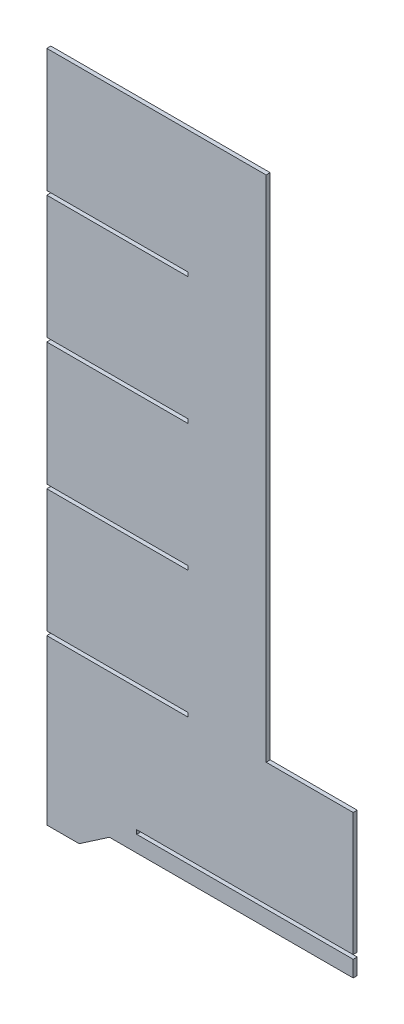
ISO-10303-21;
HEADER;
FILE_DESCRIPTION(('STEP AP214'),'2;1');
FILE_NAME('part.step','',(''),(''),'','','');
FILE_SCHEMA(('AUTOMOTIVE_DESIGN { 1 0 10303 214 1 1 1 1 }'));
ENDSEC;
DATA;
#1=APPLICATION_CONTEXT('core data for automotive mechanical design processes');
#2=APPLICATION_PROTOCOL_DEFINITION('international standard','automotive_design',2000,#1);
#3=PRODUCT_CONTEXT('',#1,'mechanical');
#4=PRODUCT('Part','Part','',(#3));
#5=PRODUCT_RELATED_PRODUCT_CATEGORY('part','',(#4));
#6=PRODUCT_DEFINITION_FORMATION('','',#4);
#7=PRODUCT_DEFINITION_CONTEXT('part definition',#1,'design');
#8=PRODUCT_DEFINITION('design','',#6,#7);
#9=PRODUCT_DEFINITION_SHAPE('','',#8);
#10=(LENGTH_UNIT() NAMED_UNIT(*) SI_UNIT(.MILLI.,.METRE.));
#11=(NAMED_UNIT(*) PLANE_ANGLE_UNIT() SI_UNIT($,.RADIAN.));
#12=(NAMED_UNIT(*) SI_UNIT($,.STERADIAN.) SOLID_ANGLE_UNIT());
#13=UNCERTAINTY_MEASURE_WITH_UNIT(LENGTH_MEASURE(1.E-05),#10,'distance_accuracy_value','');
#14=(GEOMETRIC_REPRESENTATION_CONTEXT(3) GLOBAL_UNCERTAINTY_ASSIGNED_CONTEXT((#13)) GLOBAL_UNIT_ASSIGNED_CONTEXT((#10,
#11,#12)) REPRESENTATION_CONTEXT('',''));
#15=CARTESIAN_POINT('',(0.,0.,0.));
#16=DIRECTION('',(0.,0.,1.));
#17=DIRECTION('',(1.,0.,0.));
#18=AXIS2_PLACEMENT_3D('',#15,#16,#17);
#19=CARTESIAN_POINT('',(129.013076167851,-241.346695427661,3.175));
#20=DIRECTION('',(0.,1.,0.));
#21=DIRECTION('',(0.,0.,1.));
#22=AXIS2_PLACEMENT_3D('',#19,#20,#21);
#23=PLANE('',#22);
#24=DIRECTION('',(0.,0.,1.));
#25=VECTOR('',#24,1.);
#26=CARTESIAN_POINT('',(51.8072361678507,-241.346695427661,0.));
#27=LINE('',#26,#25);
#28=CARTESIAN_POINT('',(51.8072361678507,-241.346695427661,0.));
#29=VERTEX_POINT('',#28);
#30=CARTESIAN_POINT('',(51.8072361678507,-241.346695427661,3.175));
#31=VERTEX_POINT('',#30);
#32=EDGE_CURVE('E63',#29,#31,#27,.T.);
#33=ORIENTED_EDGE('',*,*,#32,.F.);
#34=DIRECTION('',(1.,0.,0.));
#35=VECTOR('',#34,1.);
#36=CARTESIAN_POINT('',(129.013076167851,-241.346695427661,0.));
#37=LINE('',#36,#35);
#38=CARTESIAN_POINT('',(221.723076167851,-241.346695427661,0.));
#39=VERTEX_POINT('',#38);
#40=EDGE_CURVE('E224',#29,#39,#37,.T.);
#41=ORIENTED_EDGE('',*,*,#40,.T.);
#42=DIRECTION('',(0.,0.,1.));
#43=VECTOR('',#42,1.);
#44=CARTESIAN_POINT('',(221.723076167851,-241.346695427661,0.));
#45=LINE('',#44,#43);
#46=CARTESIAN_POINT('',(221.723076167851,-241.346695427661,3.175));
#47=VERTEX_POINT('',#46);
#48=EDGE_CURVE('E226',#39,#47,#45,.T.);
#49=ORIENTED_EDGE('',*,*,#48,.T.);
#50=DIRECTION('',(1.,0.,0.));
#51=VECTOR('',#50,1.);
#52=CARTESIAN_POINT('',(129.013076167851,-241.346695427661,3.175));
#53=LINE('',#52,#51);
#54=EDGE_CURVE('E395',#31,#47,#53,.T.);
#55=ORIENTED_EDGE('',*,*,#54,.F.);
#56=EDGE_LOOP('',(#33,#41,#49,#55));
#57=FACE_BOUND('',#56,.T.);
#58=ADVANCED_FACE('F39',(#57),#23,.F.);
#59=CARTESIAN_POINT('',(129.013076167851,254.245404572339,3.175));
#60=DIRECTION('',(0.,-1.,0.));
#61=DIRECTION('',(0.,0.,-1.));
#62=AXIS2_PLACEMENT_3D('',#59,#60,#61);
#63=PLANE('',#62);
#64=DIRECTION('',(-1.,0.,0.));
#65=VECTOR('',#64,1.);
#66=CARTESIAN_POINT('',(129.013076167851,254.245404572339,0.));
#67=LINE('',#66,#65);
#68=CARTESIAN_POINT('',(153.407236167851,254.245404572339,0.));
#69=VERTEX_POINT('',#68);
#70=CARTESIAN_POINT('',(-18.6853838321491,254.245404572339,0.));
#71=VERTEX_POINT('',#70);
#72=EDGE_CURVE('E341',#69,#71,#67,.T.);
#73=ORIENTED_EDGE('',*,*,#72,.T.);
#74=DIRECTION('',(0.,0.,-1.));
#75=VECTOR('',#74,1.);
#76=CARTESIAN_POINT('',(-18.6853838321491,254.245404572339,3.175));
#77=LINE('',#76,#75);
#78=CARTESIAN_POINT('',(-18.6853838321491,254.245404572339,3.175));
#79=VERTEX_POINT('',#78);
#80=EDGE_CURVE('E11',#79,#71,#77,.T.);
#81=ORIENTED_EDGE('',*,*,#80,.F.);
#82=DIRECTION('',(-1.,0.,0.));
#83=VECTOR('',#82,1.);
#84=CARTESIAN_POINT('',(129.013076167851,254.245404572339,3.175));
#85=LINE('',#84,#83);
#86=CARTESIAN_POINT('',(153.407236167851,254.245404572339,3.175));
#87=VERTEX_POINT('',#86);
#88=EDGE_CURVE('E233',#87,#79,#85,.T.);
#89=ORIENTED_EDGE('',*,*,#88,.F.);
#90=DIRECTION('',(0.,0.,1.));
#91=VECTOR('',#90,1.);
#92=CARTESIAN_POINT('',(153.407236167851,254.245404572339,0.));
#93=LINE('',#92,#91);
#94=EDGE_CURVE('E335',#69,#87,#93,.T.);
#95=ORIENTED_EDGE('',*,*,#94,.F.);
#96=EDGE_LOOP('',(#73,#81,#89,#95));
#97=FACE_BOUND('',#96,.T.);
#98=ADVANCED_FACE('F41',(#97),#63,.F.);
#99=CARTESIAN_POINT('',(-18.6853838321491,254.245404572339,3.175));
#100=DIRECTION('',(1.,0.,0.));
#101=DIRECTION('',(0.,0.,-1.));
#102=AXIS2_PLACEMENT_3D('',#99,#100,#101);
#103=PLANE('',#102);
#104=DIRECTION('',(0.,-1.,0.));
#105=VECTOR('',#104,1.);
#106=CARTESIAN_POINT('',(-18.6853838321491,254.245404572339,0.));
#107=LINE('',#106,#105);
#108=CARTESIAN_POINT('',(-18.6853838321491,157.66698457234,0.));
#109=VERTEX_POINT('',#108);
#110=EDGE_CURVE('E401',#71,#109,#107,.T.);
#111=ORIENTED_EDGE('',*,*,#110,.T.);
#112=DIRECTION('',(0.,0.,-1.));
#113=VECTOR('',#112,1.);
#114=CARTESIAN_POINT('',(-18.6853838321491,157.66698457234,3.175));
#115=LINE('',#114,#113);
#116=CARTESIAN_POINT('',(-18.6853838321491,157.66698457234,3.175));
#117=VERTEX_POINT('',#116);
#118=EDGE_CURVE('E48',#117,#109,#115,.T.);
#119=ORIENTED_EDGE('',*,*,#118,.F.);
#120=DIRECTION('',(0.,-1.,0.));
#121=VECTOR('',#120,1.);
#122=CARTESIAN_POINT('',(-18.6853838321491,254.245404572339,3.175));
#123=LINE('',#122,#121);
#124=EDGE_CURVE('E344',#79,#117,#123,.T.);
#125=ORIENTED_EDGE('',*,*,#124,.F.);
#126=ORIENTED_EDGE('',*,*,#80,.T.);
#127=EDGE_LOOP('',(#111,#119,#125,#126));
#128=FACE_BOUND('',#127,.T.);
#129=ADVANCED_FACE('F536',(#128),#103,.F.);
#130=CARTESIAN_POINT('',(92.0884611678498,157.66698457234,3.175));
#131=DIRECTION('',(0.,1.,0.));
#132=DIRECTION('',(0.,0.,1.));
#133=AXIS2_PLACEMENT_3D('',#130,#131,#132);
#134=PLANE('',#133);
#135=DIRECTION('',(1.,0.,0.));
#136=VECTOR('',#135,1.);
#137=CARTESIAN_POINT('',(92.0884611678498,157.66698457234,0.));
#138=LINE('',#137,#136);
#139=CARTESIAN_POINT('',(92.0884611678498,157.66698457234,0.));
#140=VERTEX_POINT('',#139);
#141=EDGE_CURVE('E404',#109,#140,#138,.T.);
#142=ORIENTED_EDGE('',*,*,#141,.T.);
#143=DIRECTION('',(0.,0.,-1.));
#144=VECTOR('',#143,1.);
#145=CARTESIAN_POINT('',(92.0884611678498,157.66698457234,3.175));
#146=LINE('',#145,#144);
#147=CARTESIAN_POINT('',(92.0884611678498,157.66698457234,3.175));
#148=VERTEX_POINT('',#147);
#149=EDGE_CURVE('E506',#148,#140,#146,.T.);
#150=ORIENTED_EDGE('',*,*,#149,.F.);
#151=DIRECTION('',(1.,0.,0.));
#152=VECTOR('',#151,1.);
#153=CARTESIAN_POINT('',(92.0884611678498,157.66698457234,3.175));
#154=LINE('',#153,#152);
#155=EDGE_CURVE('E347',#117,#148,#154,.T.);
#156=ORIENTED_EDGE('',*,*,#155,.F.);
#157=ORIENTED_EDGE('',*,*,#118,.T.);
#158=EDGE_LOOP('',(#142,#150,#156,#157));
#159=FACE_BOUND('',#158,.T.);
#160=ADVANCED_FACE('F515',(#159),#134,.F.);
#161=CARTESIAN_POINT('',(92.0884611678498,157.66698457234,3.175));
#162=DIRECTION('',(1.,0.,0.));
#163=DIRECTION('',(0.,0.,-1.));
#164=AXIS2_PLACEMENT_3D('',#161,#162,#163);
#165=PLANE('',#164);
#166=DIRECTION('',(0.,-1.,0.));
#167=VECTOR('',#166,1.);
#168=CARTESIAN_POINT('',(92.0884611678498,157.66698457234,0.));
#169=LINE('',#168,#167);
#170=CARTESIAN_POINT('',(92.0884611678498,154.49198457234,0.));
#171=VERTEX_POINT('',#170);
#172=EDGE_CURVE('E407',#140,#171,#169,.T.);
#173=ORIENTED_EDGE('',*,*,#172,.T.);
#174=DIRECTION('',(0.,0.,-1.));
#175=VECTOR('',#174,1.);
#176=CARTESIAN_POINT('',(92.0884611678498,154.49198457234,3.175));
#177=LINE('',#176,#175);
#178=CARTESIAN_POINT('',(92.0884611678498,154.49198457234,3.175));
#179=VERTEX_POINT('',#178);
#180=EDGE_CURVE('E502',#179,#171,#177,.T.);
#181=ORIENTED_EDGE('',*,*,#180,.F.);
#182=DIRECTION('',(0.,-1.,0.));
#183=VECTOR('',#182,1.);
#184=CARTESIAN_POINT('',(92.0884611678498,157.66698457234,3.175));
#185=LINE('',#184,#183);
#186=EDGE_CURVE('E350',#148,#179,#185,.T.);
#187=ORIENTED_EDGE('',*,*,#186,.F.);
#188=ORIENTED_EDGE('',*,*,#149,.T.);
#189=EDGE_LOOP('',(#173,#181,#187,#188));
#190=FACE_BOUND('',#189,.T.);
#191=ADVANCED_FACE('F525',(#190),#165,.F.);
#192=CARTESIAN_POINT('',(92.0884611678498,154.49198457234,3.175));
#193=DIRECTION('',(0.,-1.,0.));
#194=DIRECTION('',(1.,0.,0.));
#195=AXIS2_PLACEMENT_3D('',#192,#193,#194);
#196=PLANE('',#195);
#197=DIRECTION('',(-1.,0.,0.));
#198=VECTOR('',#197,1.);
#199=CARTESIAN_POINT('',(92.0884611678498,154.49198457234,0.));
#200=LINE('',#199,#198);
#201=CARTESIAN_POINT('',(-18.6853838321491,154.49198457234,0.));
#202=VERTEX_POINT('',#201);
#203=EDGE_CURVE('E410',#171,#202,#200,.T.);
#204=ORIENTED_EDGE('',*,*,#203,.T.);
#205=DIRECTION('',(0.,0.,-1.));
#206=VECTOR('',#205,1.);
#207=CARTESIAN_POINT('',(-18.6853838321491,154.49198457234,3.175));
#208=LINE('',#207,#206);
#209=CARTESIAN_POINT('',(-18.6853838321491,154.49198457234,3.175));
#210=VERTEX_POINT('',#209);
#211=EDGE_CURVE('E498',#210,#202,#208,.T.);
#212=ORIENTED_EDGE('',*,*,#211,.F.);
#213=DIRECTION('',(-1.,0.,0.));
#214=VECTOR('',#213,1.);
#215=CARTESIAN_POINT('',(92.0884611678498,154.49198457234,3.175));
#216=LINE('',#215,#214);
#217=EDGE_CURVE('E353',#179,#210,#216,.T.);
#218=ORIENTED_EDGE('',*,*,#217,.F.);
#219=ORIENTED_EDGE('',*,*,#180,.T.);
#220=EDGE_LOOP('',(#204,#212,#218,#219));
#221=FACE_BOUND('',#220,.T.);
#222=ADVANCED_FACE('F529',(#221),#196,.F.);
#223=CARTESIAN_POINT('',(-18.6853838321491,154.49198457234,3.175));
#224=DIRECTION('',(1.,0.,0.));
#225=DIRECTION('',(0.,0.,-1.));
#226=AXIS2_PLACEMENT_3D('',#223,#224,#225);
#227=PLANE('',#226);
#228=DIRECTION('',(0.,-1.,0.));
#229=VECTOR('',#228,1.);
#230=CARTESIAN_POINT('',(-18.6853838321491,154.49198457234,0.));
#231=LINE('',#230,#229);
#232=CARTESIAN_POINT('',(-18.6853838321491,57.9135645723403,0.));
#233=VERTEX_POINT('',#232);
#234=EDGE_CURVE('E413',#202,#233,#231,.T.);
#235=ORIENTED_EDGE('',*,*,#234,.T.);
#236=DIRECTION('',(0.,0.,-1.));
#237=VECTOR('',#236,1.);
#238=CARTESIAN_POINT('',(-18.6853838321491,57.9135645723403,3.175));
#239=LINE('',#238,#237);
#240=CARTESIAN_POINT('',(-18.6853838321491,57.9135645723403,3.175));
#241=VERTEX_POINT('',#240);
#242=EDGE_CURVE('E494',#241,#233,#239,.T.);
#243=ORIENTED_EDGE('',*,*,#242,.F.);
#244=DIRECTION('',(0.,-1.,0.));
#245=VECTOR('',#244,1.);
#246=CARTESIAN_POINT('',(-18.6853838321491,154.49198457234,3.175));
#247=LINE('',#246,#245);
#248=EDGE_CURVE('E356',#210,#241,#247,.T.);
#249=ORIENTED_EDGE('',*,*,#248,.F.);
#250=ORIENTED_EDGE('',*,*,#211,.T.);
#251=EDGE_LOOP('',(#235,#243,#249,#250));
#252=FACE_BOUND('',#251,.T.);
#253=ADVANCED_FACE('F628',(#252),#227,.F.);
#254=CARTESIAN_POINT('',(92.0884611678505,57.9135645723403,3.175));
#255=DIRECTION('',(0.,1.,0.));
#256=DIRECTION('',(0.,0.,1.));
#257=AXIS2_PLACEMENT_3D('',#254,#255,#256);
#258=PLANE('',#257);
#259=DIRECTION('',(1.,0.,0.));
#260=VECTOR('',#259,1.);
#261=CARTESIAN_POINT('',(92.0884611678505,57.9135645723403,0.));
#262=LINE('',#261,#260);
#263=CARTESIAN_POINT('',(92.0884611678505,57.9135645723403,0.));
#264=VERTEX_POINT('',#263);
#265=EDGE_CURVE('E416',#233,#264,#262,.T.);
#266=ORIENTED_EDGE('',*,*,#265,.T.);
#267=DIRECTION('',(0.,0.,-1.));
#268=VECTOR('',#267,1.);
#269=CARTESIAN_POINT('',(92.0884611678505,57.9135645723403,3.175));
#270=LINE('',#269,#268);
#271=CARTESIAN_POINT('',(92.0884611678505,57.9135645723403,3.175));
#272=VERTEX_POINT('',#271);
#273=EDGE_CURVE('E490',#272,#264,#270,.T.);
#274=ORIENTED_EDGE('',*,*,#273,.F.);
#275=DIRECTION('',(1.,0.,0.));
#276=VECTOR('',#275,1.);
#277=CARTESIAN_POINT('',(92.0884611678505,57.9135645723403,3.175));
#278=LINE('',#277,#276);
#279=EDGE_CURVE('E359',#241,#272,#278,.T.);
#280=ORIENTED_EDGE('',*,*,#279,.F.);
#281=ORIENTED_EDGE('',*,*,#242,.T.);
#282=EDGE_LOOP('',(#266,#274,#280,#281));
#283=FACE_BOUND('',#282,.T.);
#284=ADVANCED_FACE('F626',(#283),#258,.F.);
#285=CARTESIAN_POINT('',(92.0884611678505,57.9135645723403,3.175));
#286=DIRECTION('',(1.,0.,0.));
#287=DIRECTION('',(0.,0.,-1.));
#288=AXIS2_PLACEMENT_3D('',#285,#286,#287);
#289=PLANE('',#288);
#290=DIRECTION('',(0.,-1.,0.));
#291=VECTOR('',#290,1.);
#292=CARTESIAN_POINT('',(92.0884611678505,57.9135645723403,0.));
#293=LINE('',#292,#291);
#294=CARTESIAN_POINT('',(92.0884611678505,54.7385645723401,0.));
#295=VERTEX_POINT('',#294);
#296=EDGE_CURVE('E419',#264,#295,#293,.T.);
#297=ORIENTED_EDGE('',*,*,#296,.T.);
#298=DIRECTION('',(0.,0.,-1.));
#299=VECTOR('',#298,1.);
#300=CARTESIAN_POINT('',(92.0884611678505,54.7385645723401,3.175));
#301=LINE('',#300,#299);
#302=CARTESIAN_POINT('',(92.0884611678505,54.7385645723401,3.175));
#303=VERTEX_POINT('',#302);
#304=EDGE_CURVE('E486',#303,#295,#301,.T.);
#305=ORIENTED_EDGE('',*,*,#304,.F.);
#306=DIRECTION('',(0.,-1.,0.));
#307=VECTOR('',#306,1.);
#308=CARTESIAN_POINT('',(92.0884611678505,57.9135645723403,3.175));
#309=LINE('',#308,#307);
#310=EDGE_CURVE('E362',#272,#303,#309,.T.);
#311=ORIENTED_EDGE('',*,*,#310,.F.);
#312=ORIENTED_EDGE('',*,*,#273,.T.);
#313=EDGE_LOOP('',(#297,#305,#311,#312));
#314=FACE_BOUND('',#313,.T.);
#315=ADVANCED_FACE('F622',(#314),#289,.F.);
#316=CARTESIAN_POINT('',(92.0884611678505,54.7385645723401,3.175));
#317=DIRECTION('',(0.,-1.,0.));
#318=DIRECTION('',(1.,0.,0.));
#319=AXIS2_PLACEMENT_3D('',#316,#317,#318);
#320=PLANE('',#319);
#321=DIRECTION('',(-1.,0.,0.));
#322=VECTOR('',#321,1.);
#323=CARTESIAN_POINT('',(92.0884611678505,54.7385645723401,0.));
#324=LINE('',#323,#322);
#325=CARTESIAN_POINT('',(-18.6853838321491,54.7385645723401,0.));
#326=VERTEX_POINT('',#325);
#327=EDGE_CURVE('E422',#295,#326,#324,.T.);
#328=ORIENTED_EDGE('',*,*,#327,.T.);
#329=DIRECTION('',(0.,0.,-1.));
#330=VECTOR('',#329,1.);
#331=CARTESIAN_POINT('',(-18.6853838321491,54.7385645723401,3.175));
#332=LINE('',#331,#330);
#333=CARTESIAN_POINT('',(-18.6853838321491,54.7385645723401,3.175));
#334=VERTEX_POINT('',#333);
#335=EDGE_CURVE('E482',#334,#326,#332,.T.);
#336=ORIENTED_EDGE('',*,*,#335,.F.);
#337=DIRECTION('',(-1.,0.,0.));
#338=VECTOR('',#337,1.);
#339=CARTESIAN_POINT('',(92.0884611678505,54.7385645723401,3.175));
#340=LINE('',#339,#338);
#341=EDGE_CURVE('E365',#303,#334,#340,.T.);
#342=ORIENTED_EDGE('',*,*,#341,.F.);
#343=ORIENTED_EDGE('',*,*,#304,.T.);
#344=EDGE_LOOP('',(#328,#336,#342,#343));
#345=FACE_BOUND('',#344,.T.);
#346=ADVANCED_FACE('F617',(#345),#320,.F.);
#347=CARTESIAN_POINT('',(-18.6853838321491,54.7385645723401,3.175));
#348=DIRECTION('',(1.,0.,0.));
#349=DIRECTION('',(0.,0.,-1.));
#350=AXIS2_PLACEMENT_3D('',#347,#348,#349);
#351=PLANE('',#350);
#352=DIRECTION('',(0.,-1.,0.));
#353=VECTOR('',#352,1.);
#354=CARTESIAN_POINT('',(-18.6853838321491,54.7385645723401,0.));
#355=LINE('',#354,#353);
#356=CARTESIAN_POINT('',(-18.6853838321491,-41.8398554276617,0.));
#357=VERTEX_POINT('',#356);
#358=EDGE_CURVE('E425',#326,#357,#355,.T.);
#359=ORIENTED_EDGE('',*,*,#358,.T.);
#360=DIRECTION('',(0.,0.,-1.));
#361=VECTOR('',#360,1.);
#362=CARTESIAN_POINT('',(-18.6853838321491,-41.8398554276617,3.175));
#363=LINE('',#362,#361);
#364=CARTESIAN_POINT('',(-18.6853838321491,-41.8398554276617,3.175));
#365=VERTEX_POINT('',#364);
#366=EDGE_CURVE('E478',#365,#357,#363,.T.);
#367=ORIENTED_EDGE('',*,*,#366,.F.);
#368=DIRECTION('',(0.,-1.,0.));
#369=VECTOR('',#368,1.);
#370=CARTESIAN_POINT('',(-18.6853838321491,54.7385645723401,3.175));
#371=LINE('',#370,#369);
#372=EDGE_CURVE('E368',#334,#365,#371,.T.);
#373=ORIENTED_EDGE('',*,*,#372,.F.);
#374=ORIENTED_EDGE('',*,*,#335,.T.);
#375=EDGE_LOOP('',(#359,#367,#373,#374));
#376=FACE_BOUND('',#375,.T.);
#377=ADVANCED_FACE('F611',(#376),#351,.F.);
#378=CARTESIAN_POINT('',(92.0884611678512,-41.8398554276617,3.175));
#379=DIRECTION('',(0.,1.,0.));
#380=DIRECTION('',(0.,0.,1.));
#381=AXIS2_PLACEMENT_3D('',#378,#379,#380);
#382=PLANE('',#381);
#383=DIRECTION('',(1.,0.,0.));
#384=VECTOR('',#383,1.);
#385=CARTESIAN_POINT('',(92.0884611678512,-41.8398554276617,0.));
#386=LINE('',#385,#384);
#387=CARTESIAN_POINT('',(92.0884611678512,-41.8398554276617,0.));
#388=VERTEX_POINT('',#387);
#389=EDGE_CURVE('E428',#357,#388,#386,.T.);
#390=ORIENTED_EDGE('',*,*,#389,.T.);
#391=DIRECTION('',(0.,0.,-1.));
#392=VECTOR('',#391,1.);
#393=CARTESIAN_POINT('',(92.0884611678512,-41.8398554276617,3.175));
#394=LINE('',#393,#392);
#395=CARTESIAN_POINT('',(92.0884611678512,-41.8398554276617,3.175));
#396=VERTEX_POINT('',#395);
#397=EDGE_CURVE('E474',#396,#388,#394,.T.);
#398=ORIENTED_EDGE('',*,*,#397,.F.);
#399=DIRECTION('',(1.,0.,0.));
#400=VECTOR('',#399,1.);
#401=CARTESIAN_POINT('',(92.0884611678512,-41.8398554276617,3.175));
#402=LINE('',#401,#400);
#403=EDGE_CURVE('E371',#365,#396,#402,.T.);
#404=ORIENTED_EDGE('',*,*,#403,.F.);
#405=ORIENTED_EDGE('',*,*,#366,.T.);
#406=EDGE_LOOP('',(#390,#398,#404,#405));
#407=FACE_BOUND('',#406,.T.);
#408=ADVANCED_FACE('F607',(#407),#382,.F.);
#409=CARTESIAN_POINT('',(92.0884611678512,-41.8398554276617,3.175));
#410=DIRECTION('',(1.,0.,0.));
#411=DIRECTION('',(0.,0.,-1.));
#412=AXIS2_PLACEMENT_3D('',#409,#410,#411);
#413=PLANE('',#412);
#414=DIRECTION('',(0.,-1.,0.));
#415=VECTOR('',#414,1.);
#416=CARTESIAN_POINT('',(92.0884611678512,-41.8398554276617,0.));
#417=LINE('',#416,#415);
#418=CARTESIAN_POINT('',(92.0884611678512,-45.0148554276619,0.));
#419=VERTEX_POINT('',#418);
#420=EDGE_CURVE('E431',#388,#419,#417,.T.);
#421=ORIENTED_EDGE('',*,*,#420,.T.);
#422=DIRECTION('',(0.,0.,-1.));
#423=VECTOR('',#422,1.);
#424=CARTESIAN_POINT('',(92.0884611678512,-45.0148554276619,3.175));
#425=LINE('',#424,#423);
#426=CARTESIAN_POINT('',(92.0884611678512,-45.0148554276619,3.175));
#427=VERTEX_POINT('',#426);
#428=EDGE_CURVE('E470',#427,#419,#425,.T.);
#429=ORIENTED_EDGE('',*,*,#428,.F.);
#430=DIRECTION('',(0.,-1.,0.));
#431=VECTOR('',#430,1.);
#432=CARTESIAN_POINT('',(92.0884611678512,-41.8398554276617,3.175));
#433=LINE('',#432,#431);
#434=EDGE_CURVE('E374',#396,#427,#433,.T.);
#435=ORIENTED_EDGE('',*,*,#434,.F.);
#436=ORIENTED_EDGE('',*,*,#397,.T.);
#437=EDGE_LOOP('',(#421,#429,#435,#436));
#438=FACE_BOUND('',#437,.T.);
#439=ADVANCED_FACE('F602',(#438),#413,.F.);
#440=CARTESIAN_POINT('',(92.0884611678512,-45.0148554276619,3.175));
#441=DIRECTION('',(0.,-1.,0.));
#442=DIRECTION('',(1.,0.,0.));
#443=AXIS2_PLACEMENT_3D('',#440,#441,#442);
#444=PLANE('',#443);
#445=DIRECTION('',(-1.,0.,0.));
#446=VECTOR('',#445,1.);
#447=CARTESIAN_POINT('',(92.0884611678512,-45.0148554276619,0.));
#448=LINE('',#447,#446);
#449=CARTESIAN_POINT('',(-18.6853838321491,-45.0148554276619,0.));
#450=VERTEX_POINT('',#449);
#451=EDGE_CURVE('E434',#419,#450,#448,.T.);
#452=ORIENTED_EDGE('',*,*,#451,.T.);
#453=DIRECTION('',(0.,0.,-1.));
#454=VECTOR('',#453,1.);
#455=CARTESIAN_POINT('',(-18.6853838321491,-45.0148554276619,3.175));
#456=LINE('',#455,#454);
#457=CARTESIAN_POINT('',(-18.6853838321491,-45.0148554276619,3.175));
#458=VERTEX_POINT('',#457);
#459=EDGE_CURVE('E466',#458,#450,#456,.T.);
#460=ORIENTED_EDGE('',*,*,#459,.F.);
#461=DIRECTION('',(-1.,0.,0.));
#462=VECTOR('',#461,1.);
#463=CARTESIAN_POINT('',(92.0884611678512,-45.0148554276619,3.175));
#464=LINE('',#463,#462);
#465=EDGE_CURVE('E377',#427,#458,#464,.T.);
#466=ORIENTED_EDGE('',*,*,#465,.F.);
#467=ORIENTED_EDGE('',*,*,#428,.T.);
#468=EDGE_LOOP('',(#452,#460,#466,#467));
#469=FACE_BOUND('',#468,.T.);
#470=ADVANCED_FACE('F596',(#469),#444,.F.);
#471=CARTESIAN_POINT('',(-18.6853838321491,-45.0148554276619,3.175));
#472=DIRECTION('',(1.,0.,0.));
#473=DIRECTION('',(0.,0.,-1.));
#474=AXIS2_PLACEMENT_3D('',#471,#472,#473);
#475=PLANE('',#474);
#476=DIRECTION('',(0.,-1.,0.));
#477=VECTOR('',#476,1.);
#478=CARTESIAN_POINT('',(-18.6853838321491,-45.0148554276619,0.));
#479=LINE('',#478,#477);
#480=CARTESIAN_POINT('',(-18.6853838321491,-141.59327542766,0.));
#481=VERTEX_POINT('',#480);
#482=EDGE_CURVE('E437',#450,#481,#479,.T.);
#483=ORIENTED_EDGE('',*,*,#482,.T.);
#484=DIRECTION('',(0.,0.,-1.));
#485=VECTOR('',#484,1.);
#486=CARTESIAN_POINT('',(-18.6853838321491,-141.59327542766,3.175));
#487=LINE('',#486,#485);
#488=CARTESIAN_POINT('',(-18.6853838321491,-141.59327542766,3.175));
#489=VERTEX_POINT('',#488);
#490=EDGE_CURVE('E462',#489,#481,#487,.T.);
#491=ORIENTED_EDGE('',*,*,#490,.F.);
#492=DIRECTION('',(0.,-1.,0.));
#493=VECTOR('',#492,1.);
#494=CARTESIAN_POINT('',(-18.6853838321491,-45.0148554276619,3.175));
#495=LINE('',#494,#493);
#496=EDGE_CURVE('E380',#458,#489,#495,.T.);
#497=ORIENTED_EDGE('',*,*,#496,.F.);
#498=ORIENTED_EDGE('',*,*,#459,.T.);
#499=EDGE_LOOP('',(#483,#491,#497,#498));
#500=FACE_BOUND('',#499,.T.);
#501=ADVANCED_FACE('F592',(#500),#475,.F.);
#502=CARTESIAN_POINT('',(92.0884611678519,-141.59327542766,3.175));
#503=DIRECTION('',(0.,1.,0.));
#504=DIRECTION('',(0.,0.,1.));
#505=AXIS2_PLACEMENT_3D('',#502,#503,#504);
#506=PLANE('',#505);
#507=DIRECTION('',(1.,0.,0.));
#508=VECTOR('',#507,1.);
#509=CARTESIAN_POINT('',(92.0884611678519,-141.59327542766,0.));
#510=LINE('',#509,#508);
#511=CARTESIAN_POINT('',(92.0884611678519,-141.59327542766,0.));
#512=VERTEX_POINT('',#511);
#513=EDGE_CURVE('E440',#481,#512,#510,.T.);
#514=ORIENTED_EDGE('',*,*,#513,.T.);
#515=DIRECTION('',(0.,0.,-1.));
#516=VECTOR('',#515,1.);
#517=CARTESIAN_POINT('',(92.0884611678519,-141.59327542766,3.175));
#518=LINE('',#517,#516);
#519=CARTESIAN_POINT('',(92.0884611678519,-141.59327542766,3.175));
#520=VERTEX_POINT('',#519);
#521=EDGE_CURVE('E458',#520,#512,#518,.T.);
#522=ORIENTED_EDGE('',*,*,#521,.F.);
#523=DIRECTION('',(1.,0.,0.));
#524=VECTOR('',#523,1.);
#525=CARTESIAN_POINT('',(92.0884611678519,-141.59327542766,3.175));
#526=LINE('',#525,#524);
#527=EDGE_CURVE('E383',#489,#520,#526,.T.);
#528=ORIENTED_EDGE('',*,*,#527,.F.);
#529=ORIENTED_EDGE('',*,*,#490,.T.);
#530=EDGE_LOOP('',(#514,#522,#528,#529));
#531=FACE_BOUND('',#530,.T.);
#532=ADVANCED_FACE('F587',(#531),#506,.F.);
#533=CARTESIAN_POINT('',(92.0884611678519,-141.59327542766,3.175));
#534=DIRECTION('',(1.,0.,0.));
#535=DIRECTION('',(0.,0.,-1.));
#536=AXIS2_PLACEMENT_3D('',#533,#534,#535);
#537=PLANE('',#536);
#538=DIRECTION('',(0.,-1.,0.));
#539=VECTOR('',#538,1.);
#540=CARTESIAN_POINT('',(92.0884611678519,-141.59327542766,0.));
#541=LINE('',#540,#539);
#542=CARTESIAN_POINT('',(92.0884611678519,-144.76827542766,0.));
#543=VERTEX_POINT('',#542);
#544=EDGE_CURVE('E443',#512,#543,#541,.T.);
#545=ORIENTED_EDGE('',*,*,#544,.T.);
#546=DIRECTION('',(0.,0.,-1.));
#547=VECTOR('',#546,1.);
#548=CARTESIAN_POINT('',(92.0884611678519,-144.76827542766,3.175));
#549=LINE('',#548,#547);
#550=CARTESIAN_POINT('',(92.0884611678519,-144.76827542766,3.175));
#551=VERTEX_POINT('',#550);
#552=EDGE_CURVE('E454',#551,#543,#549,.T.);
#553=ORIENTED_EDGE('',*,*,#552,.F.);
#554=DIRECTION('',(0.,-1.,0.));
#555=VECTOR('',#554,1.);
#556=CARTESIAN_POINT('',(92.0884611678519,-141.59327542766,3.175));
#557=LINE('',#556,#555);
#558=EDGE_CURVE('E386',#520,#551,#557,.T.);
#559=ORIENTED_EDGE('',*,*,#558,.F.);
#560=ORIENTED_EDGE('',*,*,#521,.T.);
#561=EDGE_LOOP('',(#545,#553,#559,#560));
#562=FACE_BOUND('',#561,.T.);
#563=ADVANCED_FACE('F581',(#562),#537,.F.);
#564=CARTESIAN_POINT('',(92.0884611678519,-144.76827542766,3.175));
#565=DIRECTION('',(0.,-1.,0.));
#566=DIRECTION('',(1.,0.,0.));
#567=AXIS2_PLACEMENT_3D('',#564,#565,#566);
#568=PLANE('',#567);
#569=DIRECTION('',(-1.,0.,0.));
#570=VECTOR('',#569,1.);
#571=CARTESIAN_POINT('',(92.0884611678519,-144.76827542766,0.));
#572=LINE('',#571,#570);
#573=CARTESIAN_POINT('',(-18.6853838321491,-144.76827542766,0.));
#574=VERTEX_POINT('',#573);
#575=EDGE_CURVE('E446',#543,#574,#572,.T.);
#576=ORIENTED_EDGE('',*,*,#575,.T.);
#577=DIRECTION('',(0.,0.,-1.));
#578=VECTOR('',#577,1.);
#579=CARTESIAN_POINT('',(-18.6853838321491,-144.76827542766,3.175));
#580=LINE('',#579,#578);
#581=CARTESIAN_POINT('',(-18.6853838321491,-144.76827542766,3.175));
#582=VERTEX_POINT('',#581);
#583=EDGE_CURVE('E398',#582,#574,#580,.T.);
#584=ORIENTED_EDGE('',*,*,#583,.F.);
#585=DIRECTION('',(-1.,0.,0.));
#586=VECTOR('',#585,1.);
#587=CARTESIAN_POINT('',(92.0884611678519,-144.76827542766,3.175));
#588=LINE('',#587,#586);
#589=EDGE_CURVE('E389',#551,#582,#588,.T.);
#590=ORIENTED_EDGE('',*,*,#589,.F.);
#591=ORIENTED_EDGE('',*,*,#552,.T.);
#592=EDGE_LOOP('',(#576,#584,#590,#591));
#593=FACE_BOUND('',#592,.T.);
#594=ADVANCED_FACE('F577',(#593),#568,.F.);
#595=CARTESIAN_POINT('',(-18.6853838321491,-144.76827542766,3.175));
#596=DIRECTION('',(1.,0.,0.));
#597=DIRECTION('',(0.,0.,-1.));
#598=AXIS2_PLACEMENT_3D('',#595,#596,#597);
#599=PLANE('',#598);
#600=DIRECTION('',(0.,-1.,0.));
#601=VECTOR('',#600,1.);
#602=CARTESIAN_POINT('',(-18.6853838321491,-144.76827542766,0.));
#603=LINE('',#602,#601);
#604=CARTESIAN_POINT('',(-18.6853838321491,-273.47769542766,0.));
#605=VERTEX_POINT('',#604);
#606=EDGE_CURVE('E234',#574,#605,#603,.T.);
#607=ORIENTED_EDGE('',*,*,#606,.T.);
#608=DIRECTION('',(0.,0.,1.));
#609=VECTOR('',#608,1.);
#610=CARTESIAN_POINT('',(-18.6853838321491,-273.47769542766,0.));
#611=LINE('',#610,#609);
#612=CARTESIAN_POINT('',(-18.6853838321491,-273.47769542766,3.175));
#613=VERTEX_POINT('',#612);
#614=EDGE_CURVE('E326',#605,#613,#611,.T.);
#615=ORIENTED_EDGE('',*,*,#614,.T.);
#616=DIRECTION('',(0.,-1.,0.));
#617=VECTOR('',#616,1.);
#618=CARTESIAN_POINT('',(-18.6853838321491,-144.76827542766,3.175));
#619=LINE('',#618,#617);
#620=EDGE_CURVE('E392',#582,#613,#619,.T.);
#621=ORIENTED_EDGE('',*,*,#620,.F.);
#622=ORIENTED_EDGE('',*,*,#583,.T.);
#623=EDGE_LOOP('',(#607,#615,#621,#622));
#624=FACE_BOUND('',#623,.T.);
#625=ADVANCED_FACE('F572',(#624),#599,.F.);
#626=CARTESIAN_POINT('',(0.,0.,3.175));
#627=DIRECTION('',(0.,0.,-1.));
#628=DIRECTION('',(-1.,0.,0.));
#629=AXIS2_PLACEMENT_3D('',#626,#627,#628);
#630=PLANE('',#629);
#631=ORIENTED_EDGE('',*,*,#620,.T.);
#632=DIRECTION('',(1.,0.,0.));
#633=VECTOR('',#632,1.);
#634=CARTESIAN_POINT('',(-18.6853838321491,-273.47769542766,3.175));
#635=LINE('',#634,#633);
#636=CARTESIAN_POINT('',(6.71461616785091,-273.47769542766,3.175));
#637=VERTEX_POINT('',#636);
#638=EDGE_CURVE('E302',#613,#637,#635,.T.);
#639=ORIENTED_EDGE('',*,*,#638,.T.);
#640=DIRECTION('',(0.825560881405973,0.564313061245435,0.));
#641=VECTOR('',#640,1.);
#642=CARTESIAN_POINT('',(30.4963051092995,-257.22169542766,3.175));
#643=LINE('',#642,#641);
#644=CARTESIAN_POINT('',(30.4963051092995,-257.22169542766,3.175));
#645=VERTEX_POINT('',#644);
#646=EDGE_CURVE('E306',#637,#645,#643,.T.);
#647=ORIENTED_EDGE('',*,*,#646,.T.);
#648=DIRECTION('',(1.,0.,0.));
#649=VECTOR('',#648,1.);
#650=CARTESIAN_POINT('',(153.407236167851,-257.22169542766,3.175));
#651=LINE('',#650,#649);
#652=CARTESIAN_POINT('',(221.723076167851,-257.22169542766,3.175));
#653=VERTEX_POINT('',#652);
#654=EDGE_CURVE('E310',#645,#653,#651,.T.);
#655=ORIENTED_EDGE('',*,*,#654,.T.);
#656=DIRECTION('',(0.,1.,0.));
#657=VECTOR('',#656,1.);
#658=CARTESIAN_POINT('',(221.723076167851,-257.22169542766,3.175));
#659=LINE('',#658,#657);
#660=CARTESIAN_POINT('',(221.723076167851,-244.521695427661,3.175));
#661=VERTEX_POINT('',#660);
#662=EDGE_CURVE('E261',#653,#661,#659,.T.);
#663=ORIENTED_EDGE('',*,*,#662,.T.);
#664=DIRECTION('',(-1.,0.,0.));
#665=VECTOR('',#664,1.);
#666=CARTESIAN_POINT('',(153.407236167851,-244.521695427661,3.175));
#667=LINE('',#666,#665);
#668=CARTESIAN_POINT('',(51.8072361678507,-244.521695427661,3.175));
#669=VERTEX_POINT('',#668);
#670=EDGE_CURVE('E284',#661,#669,#667,.T.);
#671=ORIENTED_EDGE('',*,*,#670,.T.);
#672=DIRECTION('',(0.,1.,0.));
#673=VECTOR('',#672,1.);
#674=CARTESIAN_POINT('',(51.8072361678507,-244.521695427661,3.175));
#675=LINE('',#674,#673);
#676=EDGE_CURVE('E276',#669,#31,#675,.T.);
#677=ORIENTED_EDGE('',*,*,#676,.T.);
#678=ORIENTED_EDGE('',*,*,#54,.T.);
#679=DIRECTION('',(0.,1.,0.));
#680=VECTOR('',#679,1.);
#681=CARTESIAN_POINT('',(221.723076167851,-241.346695427661,3.175));
#682=LINE('',#681,#680);
#683=CARTESIAN_POINT('',(221.723076167851,-144.76827542766,3.175));
#684=VERTEX_POINT('',#683);
#685=EDGE_CURVE('E241',#47,#684,#682,.T.);
#686=ORIENTED_EDGE('',*,*,#685,.T.);
#687=DIRECTION('',(-1.,0.,0.));
#688=VECTOR('',#687,1.);
#689=CARTESIAN_POINT('',(153.407236167851,-144.76827542766,3.175));
#690=LINE('',#689,#688);
#691=CARTESIAN_POINT('',(153.407236167851,-144.76827542766,3.175));
#692=VERTEX_POINT('',#691);
#693=EDGE_CURVE('E55',#684,#692,#690,.T.);
#694=ORIENTED_EDGE('',*,*,#693,.T.);
#695=DIRECTION('',(0.,1.,0.));
#696=VECTOR('',#695,1.);
#697=CARTESIAN_POINT('',(153.407236167851,254.245404572339,3.175));
#698=LINE('',#697,#696);
#699=EDGE_CURVE('E319',#692,#87,#698,.T.);
#700=ORIENTED_EDGE('',*,*,#699,.T.);
#701=ORIENTED_EDGE('',*,*,#88,.T.);
#702=ORIENTED_EDGE('',*,*,#124,.T.);
#703=ORIENTED_EDGE('',*,*,#155,.T.);
#704=ORIENTED_EDGE('',*,*,#186,.T.);
#705=ORIENTED_EDGE('',*,*,#217,.T.);
#706=ORIENTED_EDGE('',*,*,#248,.T.);
#707=ORIENTED_EDGE('',*,*,#279,.T.);
#708=ORIENTED_EDGE('',*,*,#310,.T.);
#709=ORIENTED_EDGE('',*,*,#341,.T.);
#710=ORIENTED_EDGE('',*,*,#372,.T.);
#711=ORIENTED_EDGE('',*,*,#403,.T.);
#712=ORIENTED_EDGE('',*,*,#434,.T.);
#713=ORIENTED_EDGE('',*,*,#465,.T.);
#714=ORIENTED_EDGE('',*,*,#496,.T.);
#715=ORIENTED_EDGE('',*,*,#527,.T.);
#716=ORIENTED_EDGE('',*,*,#558,.T.);
#717=ORIENTED_EDGE('',*,*,#589,.T.);
#718=EDGE_LOOP('',(#631,#639,#647,#655,#663,#671,#677,#678,#686,#694,#700,#701,#702,#703,#704,
#705,#706,#707,#708,#709,#710,#711,#712,#713,#714,#715,#716,#717));
#719=FACE_BOUND('',#718,.T.);
#720=ADVANCED_FACE('F532',(#719),#630,.F.);
#721=CARTESIAN_POINT('',(0.,0.,0.));
#722=DIRECTION('',(0.,0.,-1.));
#723=DIRECTION('',(-1.,0.,0.));
#724=AXIS2_PLACEMENT_3D('',#721,#722,#723);
#725=PLANE('',#724);
#726=ORIENTED_EDGE('',*,*,#72,.F.);
#727=DIRECTION('',(0.,1.,0.));
#728=VECTOR('',#727,1.);
#729=CARTESIAN_POINT('',(153.407236167851,254.245404572339,0.));
#730=LINE('',#729,#728);
#731=CARTESIAN_POINT('',(153.407236167851,-144.76827542766,0.));
#732=VERTEX_POINT('',#731);
#733=EDGE_CURVE('E332',#732,#69,#730,.T.);
#734=ORIENTED_EDGE('',*,*,#733,.F.);
#735=DIRECTION('',(-1.,0.,0.));
#736=VECTOR('',#735,1.);
#737=CARTESIAN_POINT('',(153.407236167851,-144.76827542766,0.));
#738=LINE('',#737,#736);
#739=CARTESIAN_POINT('',(221.723076167851,-144.76827542766,0.));
#740=VERTEX_POINT('',#739);
#741=EDGE_CURVE('E244',#740,#732,#738,.T.);
#742=ORIENTED_EDGE('',*,*,#741,.F.);
#743=DIRECTION('',(0.,1.,0.));
#744=VECTOR('',#743,1.);
#745=CARTESIAN_POINT('',(221.723076167851,-241.346695427661,0.));
#746=LINE('',#745,#744);
#747=EDGE_CURVE('E239',#39,#740,#746,.T.);
#748=ORIENTED_EDGE('',*,*,#747,.F.);
#749=ORIENTED_EDGE('',*,*,#40,.F.);
#750=DIRECTION('',(0.,1.,0.));
#751=VECTOR('',#750,1.);
#752=CARTESIAN_POINT('',(51.8072361678507,-244.521695427661,0.));
#753=LINE('',#752,#751);
#754=CARTESIAN_POINT('',(51.8072361678507,-244.521695427661,0.));
#755=VERTEX_POINT('',#754);
#756=EDGE_CURVE('E280',#755,#29,#753,.T.);
#757=ORIENTED_EDGE('',*,*,#756,.F.);
#758=DIRECTION('',(-1.,0.,0.));
#759=VECTOR('',#758,1.);
#760=CARTESIAN_POINT('',(153.407236167851,-244.521695427661,0.));
#761=LINE('',#760,#759);
#762=CARTESIAN_POINT('',(221.723076167851,-244.521695427661,0.));
#763=VERTEX_POINT('',#762);
#764=EDGE_CURVE('E295',#763,#755,#761,.T.);
#765=ORIENTED_EDGE('',*,*,#764,.F.);
#766=DIRECTION('',(0.,1.,0.));
#767=VECTOR('',#766,1.);
#768=CARTESIAN_POINT('',(221.723076167851,-257.22169542766,0.));
#769=LINE('',#768,#767);
#770=CARTESIAN_POINT('',(221.723076167851,-257.22169542766,0.));
#771=VERTEX_POINT('',#770);
#772=EDGE_CURVE('E264',#771,#763,#769,.T.);
#773=ORIENTED_EDGE('',*,*,#772,.F.);
#774=DIRECTION('',(1.,0.,0.));
#775=VECTOR('',#774,1.);
#776=CARTESIAN_POINT('',(153.407236167851,-257.22169542766,0.));
#777=LINE('',#776,#775);
#778=CARTESIAN_POINT('',(30.4963051092995,-257.22169542766,0.));
#779=VERTEX_POINT('',#778);
#780=EDGE_CURVE('E292',#779,#771,#777,.T.);
#781=ORIENTED_EDGE('',*,*,#780,.F.);
#782=DIRECTION('',(0.825560881405973,0.564313061245435,0.));
#783=VECTOR('',#782,1.);
#784=CARTESIAN_POINT('',(30.4963051092995,-257.22169542766,0.));
#785=LINE('',#784,#783);
#786=CARTESIAN_POINT('',(6.71461616785091,-273.47769542766,0.));
#787=VERTEX_POINT('',#786);
#788=EDGE_CURVE('E288',#787,#779,#785,.T.);
#789=ORIENTED_EDGE('',*,*,#788,.F.);
#790=DIRECTION('',(1.,0.,0.));
#791=VECTOR('',#790,1.);
#792=CARTESIAN_POINT('',(-18.6853838321491,-273.47769542766,0.));
#793=LINE('',#792,#791);
#794=EDGE_CURVE('E283',#605,#787,#793,.T.);
#795=ORIENTED_EDGE('',*,*,#794,.F.);
#796=ORIENTED_EDGE('',*,*,#606,.F.);
#797=ORIENTED_EDGE('',*,*,#575,.F.);
#798=ORIENTED_EDGE('',*,*,#544,.F.);
#799=ORIENTED_EDGE('',*,*,#513,.F.);
#800=ORIENTED_EDGE('',*,*,#482,.F.);
#801=ORIENTED_EDGE('',*,*,#451,.F.);
#802=ORIENTED_EDGE('',*,*,#420,.F.);
#803=ORIENTED_EDGE('',*,*,#389,.F.);
#804=ORIENTED_EDGE('',*,*,#358,.F.);
#805=ORIENTED_EDGE('',*,*,#327,.F.);
#806=ORIENTED_EDGE('',*,*,#296,.F.);
#807=ORIENTED_EDGE('',*,*,#265,.F.);
#808=ORIENTED_EDGE('',*,*,#234,.F.);
#809=ORIENTED_EDGE('',*,*,#203,.F.);
#810=ORIENTED_EDGE('',*,*,#172,.F.);
#811=ORIENTED_EDGE('',*,*,#141,.F.);
#812=ORIENTED_EDGE('',*,*,#110,.F.);
#813=EDGE_LOOP('',(#726,#734,#742,#748,#749,#757,#765,#773,#781,#789,#795,#796,#797,#798,#799,
#800,#801,#802,#803,#804,#805,#806,#807,#808,#809,#810,#811,#812));
#814=FACE_BOUND('',#813,.T.);
#815=ADVANCED_FACE('F247',(#814),#725,.T.);
#816=CARTESIAN_POINT('',(153.407236167851,254.245404572339,0.));
#817=DIRECTION('',(1.,0.,0.));
#818=DIRECTION('',(0.,1.,0.));
#819=AXIS2_PLACEMENT_3D('',#816,#817,#818);
#820=PLANE('',#819);
#821=DIRECTION('',(0.,0.,1.));
#822=VECTOR('',#821,1.);
#823=CARTESIAN_POINT('',(153.407236167851,-144.76827542766,0.));
#824=LINE('',#823,#822);
#825=EDGE_CURVE('E258',#732,#692,#824,.T.);
#826=ORIENTED_EDGE('',*,*,#825,.F.);
#827=ORIENTED_EDGE('',*,*,#733,.T.);
#828=ORIENTED_EDGE('',*,*,#94,.T.);
#829=ORIENTED_EDGE('',*,*,#699,.F.);
#830=EDGE_LOOP('',(#826,#827,#828,#829));
#831=FACE_BOUND('',#830,.T.);
#832=ADVANCED_FACE('F541',(#831),#820,.T.);
#833=CARTESIAN_POINT('',(51.8072361678507,-244.521695427661,0.));
#834=DIRECTION('',(1.,0.,0.));
#835=DIRECTION('',(0.,1.,0.));
#836=AXIS2_PLACEMENT_3D('',#833,#834,#835);
#837=PLANE('',#836);
#838=ORIENTED_EDGE('',*,*,#676,.F.);
#839=DIRECTION('',(0.,0.,1.));
#840=VECTOR('',#839,1.);
#841=CARTESIAN_POINT('',(51.8072361678507,-244.521695427661,0.));
#842=LINE('',#841,#840);
#843=EDGE_CURVE('E316',#755,#669,#842,.T.);
#844=ORIENTED_EDGE('',*,*,#843,.F.);
#845=ORIENTED_EDGE('',*,*,#756,.T.);
#846=ORIENTED_EDGE('',*,*,#32,.T.);
#847=EDGE_LOOP('',(#838,#844,#845,#846));
#848=FACE_BOUND('',#847,.T.);
#849=ADVANCED_FACE('F547',(#848),#837,.T.);
#850=CARTESIAN_POINT('',(153.407236167851,-244.521695427661,0.));
#851=DIRECTION('',(0.,1.,0.));
#852=DIRECTION('',(0.,0.,1.));
#853=AXIS2_PLACEMENT_3D('',#850,#851,#852);
#854=PLANE('',#853);
#855=ORIENTED_EDGE('',*,*,#670,.F.);
#856=DIRECTION('',(0.,0.,1.));
#857=VECTOR('',#856,1.);
#858=CARTESIAN_POINT('',(221.723076167851,-244.521695427661,0.));
#859=LINE('',#858,#857);
#860=EDGE_CURVE('E272',#763,#661,#859,.T.);
#861=ORIENTED_EDGE('',*,*,#860,.F.);
#862=ORIENTED_EDGE('',*,*,#764,.T.);
#863=ORIENTED_EDGE('',*,*,#843,.T.);
#864=EDGE_LOOP('',(#855,#861,#862,#863));
#865=FACE_BOUND('',#864,.T.);
#866=ADVANCED_FACE('F551',(#865),#854,.T.);
#867=CARTESIAN_POINT('',(153.407236167851,-257.22169542766,0.));
#868=DIRECTION('',(0.,-1.,0.));
#869=DIRECTION('',(0.,0.,-1.));
#870=AXIS2_PLACEMENT_3D('',#867,#868,#869);
#871=PLANE('',#870);
#872=ORIENTED_EDGE('',*,*,#654,.F.);
#873=DIRECTION('',(0.,0.,1.));
#874=VECTOR('',#873,1.);
#875=CARTESIAN_POINT('',(30.4963051092995,-257.22169542766,0.));
#876=LINE('',#875,#874);
#877=EDGE_CURVE('E320',#779,#645,#876,.T.);
#878=ORIENTED_EDGE('',*,*,#877,.F.);
#879=ORIENTED_EDGE('',*,*,#780,.T.);
#880=DIRECTION('',(0.,0.,1.));
#881=VECTOR('',#880,1.);
#882=CARTESIAN_POINT('',(221.723076167851,-257.22169542766,0.));
#883=LINE('',#882,#881);
#884=EDGE_CURVE('E268',#771,#653,#883,.T.);
#885=ORIENTED_EDGE('',*,*,#884,.T.);
#886=EDGE_LOOP('',(#872,#878,#879,#885));
#887=FACE_BOUND('',#886,.T.);
#888=ADVANCED_FACE('F733',(#887),#871,.T.);
#889=CARTESIAN_POINT('',(30.4963051092995,-257.22169542766,0.));
#890=DIRECTION('',(0.564313061245435,-0.825560881405973,0.));
#891=DIRECTION('',(0.825560881405973,0.564313061245435,0.));
#892=AXIS2_PLACEMENT_3D('',#889,#890,#891);
#893=PLANE('',#892);
#894=ORIENTED_EDGE('',*,*,#646,.F.);
#895=DIRECTION('',(0.,0.,1.));
#896=VECTOR('',#895,1.);
#897=CARTESIAN_POINT('',(6.71461616785091,-273.47769542766,0.));
#898=LINE('',#897,#896);
#899=EDGE_CURVE('E323',#787,#637,#898,.T.);
#900=ORIENTED_EDGE('',*,*,#899,.F.);
#901=ORIENTED_EDGE('',*,*,#788,.T.);
#902=ORIENTED_EDGE('',*,*,#877,.T.);
#903=EDGE_LOOP('',(#894,#900,#901,#902));
#904=FACE_BOUND('',#903,.T.);
#905=ADVANCED_FACE('F562',(#904),#893,.T.);
#906=CARTESIAN_POINT('',(-18.6853838321491,-273.47769542766,0.));
#907=DIRECTION('',(0.,-1.,0.));
#908=DIRECTION('',(0.,0.,-1.));
#909=AXIS2_PLACEMENT_3D('',#906,#907,#908);
#910=PLANE('',#909);
#911=ORIENTED_EDGE('',*,*,#638,.F.);
#912=ORIENTED_EDGE('',*,*,#614,.F.);
#913=ORIENTED_EDGE('',*,*,#794,.T.);
#914=ORIENTED_EDGE('',*,*,#899,.T.);
#915=EDGE_LOOP('',(#911,#912,#913,#914));
#916=FACE_BOUND('',#915,.T.);
#917=ADVANCED_FACE('F566',(#916),#910,.T.);
#918=CARTESIAN_POINT('',(221.723076167851,-257.22169542766,0.));
#919=DIRECTION('',(1.,0.,0.));
#920=DIRECTION('',(0.,0.,-1.));
#921=AXIS2_PLACEMENT_3D('',#918,#919,#920);
#922=PLANE('',#921);
#923=ORIENTED_EDGE('',*,*,#662,.F.);
#924=ORIENTED_EDGE('',*,*,#884,.F.);
#925=ORIENTED_EDGE('',*,*,#772,.T.);
#926=ORIENTED_EDGE('',*,*,#860,.T.);
#927=EDGE_LOOP('',(#923,#924,#925,#926));
#928=FACE_BOUND('',#927,.T.);
#929=ADVANCED_FACE('F555',(#928),#922,.T.);
#930=CARTESIAN_POINT('',(153.407236167851,-144.76827542766,0.));
#931=DIRECTION('',(0.,1.,0.));
#932=DIRECTION('',(0.,0.,1.));
#933=AXIS2_PLACEMENT_3D('',#930,#931,#932);
#934=PLANE('',#933);
#935=ORIENTED_EDGE('',*,*,#693,.F.);
#936=DIRECTION('',(0.,0.,1.));
#937=VECTOR('',#936,1.);
#938=CARTESIAN_POINT('',(221.723076167851,-144.76827542766,0.));
#939=LINE('',#938,#937);
#940=EDGE_CURVE('E243',#740,#684,#939,.T.);
#941=ORIENTED_EDGE('',*,*,#940,.F.);
#942=ORIENTED_EDGE('',*,*,#741,.T.);
#943=ORIENTED_EDGE('',*,*,#825,.T.);
#944=EDGE_LOOP('',(#935,#941,#942,#943));
#945=FACE_BOUND('',#944,.T.);
#946=ADVANCED_FACE('F544',(#945),#934,.T.);
#947=CARTESIAN_POINT('',(221.723076167851,-241.346695427661,0.));
#948=DIRECTION('',(1.,0.,0.));
#949=DIRECTION('',(0.,0.,-1.));
#950=AXIS2_PLACEMENT_3D('',#947,#948,#949);
#951=PLANE('',#950);
#952=ORIENTED_EDGE('',*,*,#685,.F.);
#953=ORIENTED_EDGE('',*,*,#48,.F.);
#954=ORIENTED_EDGE('',*,*,#747,.T.);
#955=ORIENTED_EDGE('',*,*,#940,.T.);
#956=EDGE_LOOP('',(#952,#953,#954,#955));
#957=FACE_BOUND('',#956,.T.);
#958=ADVANCED_FACE('F238',(#957),#951,.T.);
#959=CLOSED_SHELL('',(#58,#98,#129,#160,#191,#222,#253,#284,#315,#346,#377,#408,#439,#470,#501,
#532,#563,#594,#625,#720,#815,#832,#849,#866,#888,#905,#917,#929,#946,#958));
#960=MANIFOLD_SOLID_BREP('B2',#959);
#961=ADVANCED_BREP_SHAPE_REPRESENTATION('',(#18,#960),#14);
#962=SHAPE_DEFINITION_REPRESENTATION(#9,#961);
ENDSEC;
END-ISO-10303-21;
